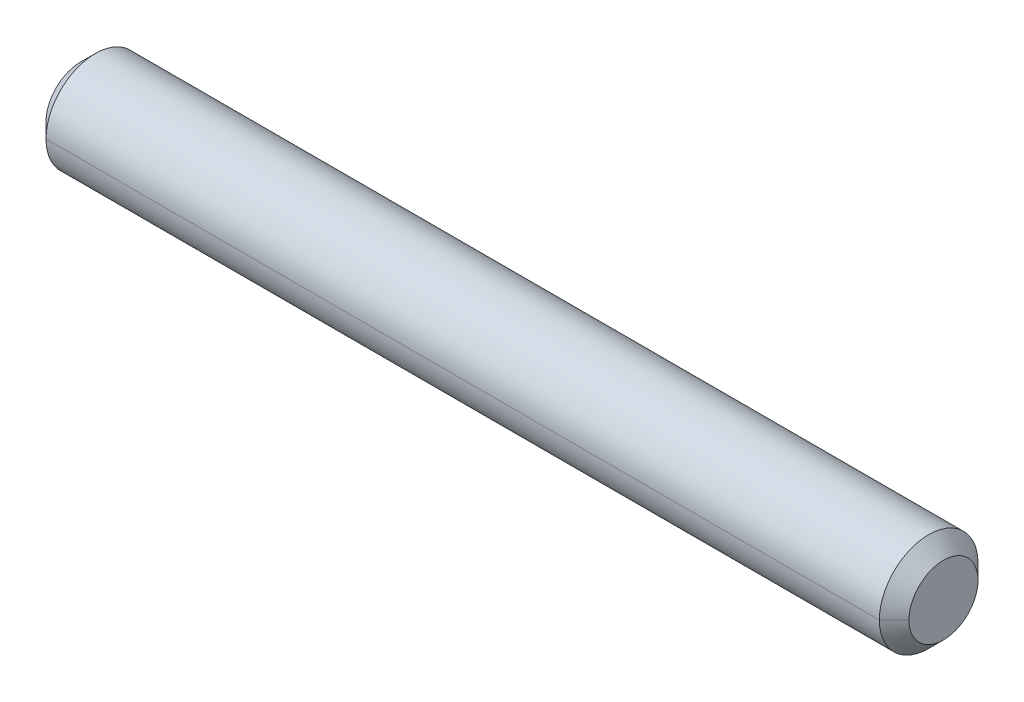
ISO-10303-21;
HEADER;
FILE_DESCRIPTION(('STEP AP214'),'2;1');
FILE_NAME('part.step','',(''),(''),'','','');
FILE_SCHEMA(('AUTOMOTIVE_DESIGN { 1 0 10303 214 1 1 1 1 }'));
ENDSEC;
DATA;
#1=APPLICATION_CONTEXT('core data for automotive mechanical design processes');
#2=APPLICATION_PROTOCOL_DEFINITION('international standard','automotive_design',2000,#1);
#3=PRODUCT_CONTEXT('',#1,'mechanical');
#4=PRODUCT('Part','Part','',(#3));
#5=PRODUCT_RELATED_PRODUCT_CATEGORY('part','',(#4));
#6=PRODUCT_DEFINITION_FORMATION('','',#4);
#7=PRODUCT_DEFINITION_CONTEXT('part definition',#1,'design');
#8=PRODUCT_DEFINITION('design','',#6,#7);
#9=PRODUCT_DEFINITION_SHAPE('','',#8);
#10=(LENGTH_UNIT() NAMED_UNIT(*) SI_UNIT(.MILLI.,.METRE.));
#11=(NAMED_UNIT(*) PLANE_ANGLE_UNIT() SI_UNIT($,.RADIAN.));
#12=(NAMED_UNIT(*) SI_UNIT($,.STERADIAN.) SOLID_ANGLE_UNIT());
#13=UNCERTAINTY_MEASURE_WITH_UNIT(LENGTH_MEASURE(1.E-05),#10,'distance_accuracy_value','');
#14=(GEOMETRIC_REPRESENTATION_CONTEXT(3) GLOBAL_UNCERTAINTY_ASSIGNED_CONTEXT((#13)) GLOBAL_UNIT_ASSIGNED_CONTEXT((#10,
#11,#12)) REPRESENTATION_CONTEXT('',''));
#15=CARTESIAN_POINT('',(0.,0.,0.));
#16=DIRECTION('',(0.,0.,1.));
#17=DIRECTION('',(1.,0.,0.));
#18=AXIS2_PLACEMENT_3D('',#15,#16,#17);
#19=CARTESIAN_POINT('',(211363.475899207,8888.20041192061,-3.50934559190108E-12));
#20=DIRECTION('',(1.,0.,0.));
#21=DIRECTION('',(0.,0.,-1.));
#22=AXIS2_PLACEMENT_3D('',#19,#20,#21);
#23=CONICAL_SURFACE('',#22,0.999999999999451,0.785398163379684);
#24=CARTESIAN_POINT('',(211363.175899206,8888.20041192061,5.83214032623403E-12));
#25=DIRECTION('',(-1.,0.,0.));
#26=DIRECTION('',(0.,0.,1.));
#27=AXIS2_PLACEMENT_3D('',#24,#25,#26);
#28=CIRCLE('',#27,0.700000000000149);
#29=CARTESIAN_POINT('',(211363.175899206,8888.20041192061,0.700000000005977));
#30=VERTEX_POINT('',#29);
#31=CARTESIAN_POINT('',(211363.175899206,8888.20041192061,-0.699999999994313));
#32=VERTEX_POINT('',#31);
#33=EDGE_CURVE('E41',#30,#32,#28,.T.);
#34=ORIENTED_EDGE('',*,*,#33,.F.);
#35=DIRECTION('',(0.707106781199109,0.,0.707106781173987));
#36=VECTOR('',#35,1.);
#37=CARTESIAN_POINT('',(211363.475899207,8888.20041192061,0.999999999995942));
#38=LINE('',#37,#36);
#39=CARTESIAN_POINT('',(211363.475899207,8888.20041192061,0.999999999995942));
#40=VERTEX_POINT('',#39);
#41=EDGE_CURVE('E11',#30,#40,#38,.T.);
#42=ORIENTED_EDGE('',*,*,#41,.T.);
#43=CARTESIAN_POINT('',(211363.475899207,8888.20041192061,-3.50934559190108E-12));
#44=DIRECTION('',(-1.,0.,0.));
#45=DIRECTION('',(0.,0.,1.));
#46=AXIS2_PLACEMENT_3D('',#43,#44,#45);
#47=CIRCLE('',#46,0.999999999999451);
#48=CARTESIAN_POINT('',(211363.475899207,8888.20041192061,-1.00000000000295));
#49=VERTEX_POINT('',#48);
#50=EDGE_CURVE('E27',#40,#49,#47,.T.);
#51=ORIENTED_EDGE('',*,*,#50,.T.);
#52=DIRECTION('',(0.707106781199108,0.,-0.707106781173987));
#53=VECTOR('',#52,1.);
#54=CARTESIAN_POINT('',(211363.475899207,8888.20041192061,-1.00000000000296));
#55=LINE('',#54,#53);
#56=EDGE_CURVE('E90',#32,#49,#55,.T.);
#57=ORIENTED_EDGE('',*,*,#56,.F.);
#58=EDGE_LOOP('',(#34,#42,#51,#57));
#59=FACE_BOUND('',#58,.T.);
#60=ADVANCED_FACE('F16',(#59),#23,.T.);
#61=CARTESIAN_POINT('',(211363.175899206,8888.20041192061,5.83214032623403E-12));
#62=DIRECTION('',(-1.,0.,0.));
#63=DIRECTION('',(0.,0.,1.));
#64=AXIS2_PLACEMENT_3D('',#61,#62,#63);
#65=CYLINDRICAL_SURFACE('',#64,0.999999999999451);
#66=CARTESIAN_POINT('',(211380.375899206,8888.20041192061,-1.21083698623181E-11));
#67=DIRECTION('',(-1.,0.,0.));
#68=DIRECTION('',(0.,0.,1.));
#69=AXIS2_PLACEMENT_3D('',#66,#67,#68);
#70=CIRCLE('',#69,0.999999999999451);
#71=CARTESIAN_POINT('',(211380.375899206,8888.20041192061,0.999999999806076));
#72=VERTEX_POINT('',#71);
#73=CARTESIAN_POINT('',(211380.375899206,8888.20041192061,-0.999999999794918));
#74=VERTEX_POINT('',#73);
#75=EDGE_CURVE('E118',#72,#74,#70,.T.);
#76=ORIENTED_EDGE('',*,*,#75,.T.);
#77=DIRECTION('',(-1.,0.,0.));
#78=VECTOR('',#77,1.);
#79=CARTESIAN_POINT('',(211363.175899206,8888.20041192061,-0.999999999993619));
#80=LINE('',#79,#78);
#81=EDGE_CURVE('E115',#74,#49,#80,.T.);
#82=ORIENTED_EDGE('',*,*,#81,.T.);
#83=ORIENTED_EDGE('',*,*,#50,.F.);
#84=DIRECTION('',(-1.,0.,0.));
#85=VECTOR('',#84,1.);
#86=CARTESIAN_POINT('',(211363.175899206,8888.20041192061,1.00000000000528));
#87=LINE('',#86,#85);
#88=EDGE_CURVE('E97',#72,#40,#87,.T.);
#89=ORIENTED_EDGE('',*,*,#88,.F.);
#90=EDGE_LOOP('',(#76,#82,#83,#89));
#91=FACE_BOUND('',#90,.T.);
#92=ADVANCED_FACE('F209',(#91),#65,.T.);
#93=CARTESIAN_POINT('',(211380.675899206,8888.20041192061,5.57887069874141E-12));
#94=DIRECTION('',(-1.,0.,0.));
#95=DIRECTION('',(0.,0.,1.));
#96=AXIS2_PLACEMENT_3D('',#93,#94,#95);
#97=CONICAL_SURFACE('',#96,0.700000000000149,0.785398163379684);
#98=CARTESIAN_POINT('',(211380.675899206,8888.20041192061,5.57887069874141E-12));
#99=DIRECTION('',(-1.,0.,0.));
#100=DIRECTION('',(0.,0.,1.));
#101=AXIS2_PLACEMENT_3D('',#98,#99,#100);
#102=CIRCLE('',#101,0.700000000000149);
#103=CARTESIAN_POINT('',(211380.675899206,8888.20041192061,0.700000000005727));
#104=VERTEX_POINT('',#103);
#105=CARTESIAN_POINT('',(211380.675899206,8888.20041192061,-0.699999999994566));
#106=VERTEX_POINT('',#105);
#107=EDGE_CURVE('E119',#104,#106,#102,.T.);
#108=ORIENTED_EDGE('',*,*,#107,.T.);
#109=DIRECTION('',(-0.707106781199109,0.,-0.707106781173987));
#110=VECTOR('',#109,1.);
#111=CARTESIAN_POINT('',(211380.675899206,8888.20041192061,-0.69999999999457));
#112=LINE('',#111,#110);
#113=EDGE_CURVE('E63',#106,#74,#112,.T.);
#114=ORIENTED_EDGE('',*,*,#113,.T.);
#115=ORIENTED_EDGE('',*,*,#75,.F.);
#116=DIRECTION('',(-0.707106781199108,0.,0.707106781173987));
#117=VECTOR('',#116,1.);
#118=CARTESIAN_POINT('',(211380.675899206,8888.20041192061,0.700000000005727));
#119=LINE('',#118,#117);
#120=EDGE_CURVE('E75',#104,#72,#119,.T.);
#121=ORIENTED_EDGE('',*,*,#120,.F.);
#122=EDGE_LOOP('',(#108,#114,#115,#121));
#123=FACE_BOUND('',#122,.T.);
#124=ADVANCED_FACE('F18',(#123),#97,.T.);
#125=CARTESIAN_POINT('',(211380.675899206,8709.56037628374,5.55805401702969E-12));
#126=DIRECTION('',(1.,0.,0.));
#127=DIRECTION('',(0.,0.,-1.));
#128=AXIS2_PLACEMENT_3D('',#125,#126,#127);
#129=PLANE('',#128);
#130=ORIENTED_EDGE('',*,*,#107,.F.);
#131=CARTESIAN_POINT('',(211380.675899206,8888.20041192061,5.57887069874141E-12));
#132=DIRECTION('',(-1.,0.,0.));
#133=DIRECTION('',(0.,0.,1.));
#134=AXIS2_PLACEMENT_3D('',#131,#132,#133);
#135=CIRCLE('',#134,0.700000000000149);
#136=EDGE_CURVE('E123',#106,#104,#135,.T.);
#137=ORIENTED_EDGE('',*,*,#136,.F.);
#138=EDGE_LOOP('',(#130,#137));
#139=FACE_BOUND('',#138,.T.);
#140=ADVANCED_FACE('F222',(#139),#129,.T.);
#141=CARTESIAN_POINT('',(211380.675899206,8888.20041192061,5.57887069874141E-12));
#142=DIRECTION('',(-1.,0.,0.));
#143=DIRECTION('',(0.,0.,1.));
#144=AXIS2_PLACEMENT_3D('',#141,#142,#143);
#145=CONICAL_SURFACE('',#144,0.700000000000149,0.785398163379684);
#146=ORIENTED_EDGE('',*,*,#113,.F.);
#147=ORIENTED_EDGE('',*,*,#136,.T.);
#148=ORIENTED_EDGE('',*,*,#120,.T.);
#149=CARTESIAN_POINT('',(211380.375899206,8888.20041192061,-1.21083698623181E-11));
#150=DIRECTION('',(-1.,0.,0.));
#151=DIRECTION('',(0.,0.,1.));
#152=AXIS2_PLACEMENT_3D('',#149,#150,#151);
#153=CIRCLE('',#152,0.999999999999451);
#154=EDGE_CURVE('E111',#74,#72,#153,.T.);
#155=ORIENTED_EDGE('',*,*,#154,.F.);
#156=EDGE_LOOP('',(#146,#147,#148,#155));
#157=FACE_BOUND('',#156,.T.);
#158=ADVANCED_FACE('F226',(#157),#145,.T.);
#159=CARTESIAN_POINT('',(211363.175899206,8888.20041192061,5.83214032623403E-12));
#160=DIRECTION('',(-1.,0.,0.));
#161=DIRECTION('',(0.,0.,1.));
#162=AXIS2_PLACEMENT_3D('',#159,#160,#161);
#163=CYLINDRICAL_SURFACE('',#162,0.999999999999451);
#164=ORIENTED_EDGE('',*,*,#81,.F.);
#165=ORIENTED_EDGE('',*,*,#154,.T.);
#166=ORIENTED_EDGE('',*,*,#88,.T.);
#167=CARTESIAN_POINT('',(211363.475899207,8888.20041192061,-3.50934559190108E-12));
#168=DIRECTION('',(-1.,0.,0.));
#169=DIRECTION('',(0.,0.,1.));
#170=AXIS2_PLACEMENT_3D('',#167,#168,#169);
#171=CIRCLE('',#170,0.999999999999451);
#172=EDGE_CURVE('E98',#49,#40,#171,.T.);
#173=ORIENTED_EDGE('',*,*,#172,.F.);
#174=EDGE_LOOP('',(#164,#165,#166,#173));
#175=FACE_BOUND('',#174,.T.);
#176=ADVANCED_FACE('F232',(#175),#163,.T.);
#177=CARTESIAN_POINT('',(211363.475899207,8888.20041192061,-3.50934559190108E-12));
#178=DIRECTION('',(1.,0.,0.));
#179=DIRECTION('',(0.,0.,-1.));
#180=AXIS2_PLACEMENT_3D('',#177,#178,#179);
#181=CONICAL_SURFACE('',#180,0.999999999999451,0.785398163379684);
#182=ORIENTED_EDGE('',*,*,#41,.F.);
#183=CARTESIAN_POINT('',(211363.175899206,8888.20041192061,5.83214032623403E-12));
#184=DIRECTION('',(-1.,0.,0.));
#185=DIRECTION('',(0.,0.,1.));
#186=AXIS2_PLACEMENT_3D('',#183,#184,#185);
#187=CIRCLE('',#186,0.700000000000149);
#188=EDGE_CURVE('E20',#32,#30,#187,.T.);
#189=ORIENTED_EDGE('',*,*,#188,.F.);
#190=ORIENTED_EDGE('',*,*,#56,.T.);
#191=ORIENTED_EDGE('',*,*,#172,.T.);
#192=EDGE_LOOP('',(#182,#189,#190,#191));
#193=FACE_BOUND('',#192,.T.);
#194=ADVANCED_FACE('F100',(#193),#181,.T.);
#195=CARTESIAN_POINT('',(211363.175899206,8709.56037628374,5.81132364452231E-12));
#196=DIRECTION('',(-1.,0.,0.));
#197=DIRECTION('',(0.,1.,0.));
#198=AXIS2_PLACEMENT_3D('',#195,#196,#197);
#199=PLANE('',#198);
#200=ORIENTED_EDGE('',*,*,#188,.T.);
#201=ORIENTED_EDGE('',*,*,#33,.T.);
#202=EDGE_LOOP('',(#200,#201));
#203=FACE_BOUND('',#202,.T.);
#204=ADVANCED_FACE('F86',(#203),#199,.T.);
#205=CLOSED_SHELL('',(#60,#92,#124,#140,#158,#176,#194,#204));
#206=MANIFOLD_SOLID_BREP('B1',#205);
#207=ADVANCED_BREP_SHAPE_REPRESENTATION('',(#18,#206),#14);
#208=SHAPE_DEFINITION_REPRESENTATION(#9,#207);
ENDSEC;
END-ISO-10303-21;
